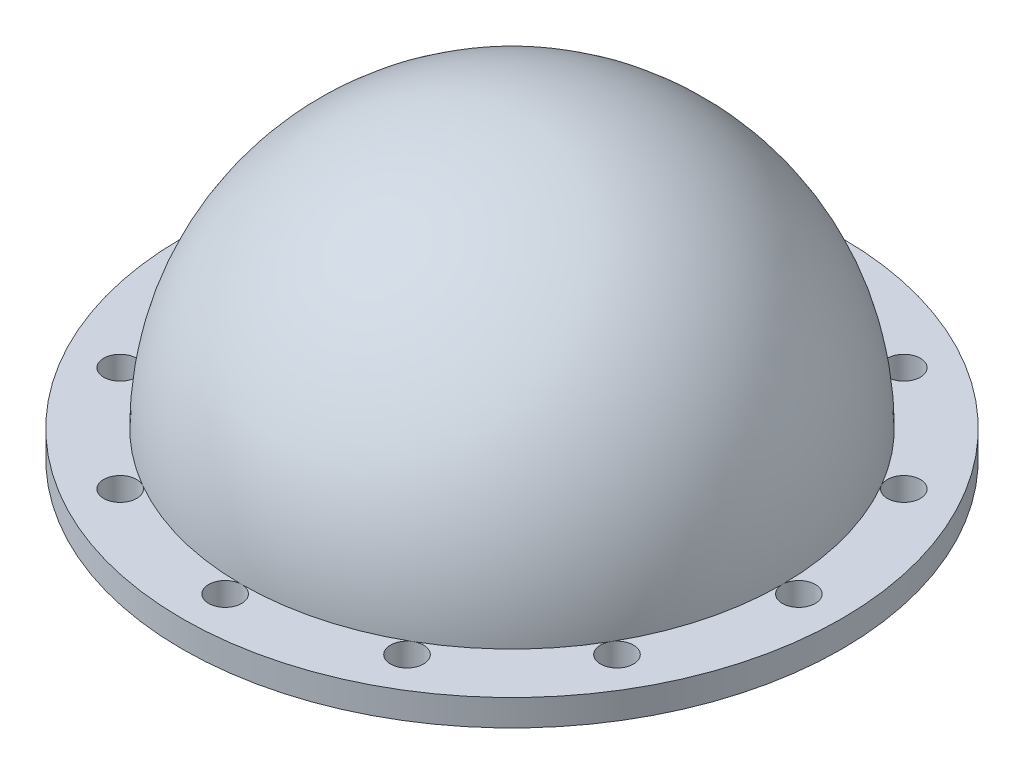
ISO-10303-21;
HEADER;
FILE_DESCRIPTION(('STEP AP214'),'2;1');
FILE_NAME('part.step','',(''),(''),'','','');
FILE_SCHEMA(('AUTOMOTIVE_DESIGN { 1 0 10303 214 1 1 1 1 }'));
ENDSEC;
DATA;
#1=APPLICATION_CONTEXT('core data for automotive mechanical design processes');
#2=APPLICATION_PROTOCOL_DEFINITION('international standard','automotive_design',2000,#1);
#3=PRODUCT_CONTEXT('',#1,'mechanical');
#4=PRODUCT('Part','Part','',(#3));
#5=PRODUCT_RELATED_PRODUCT_CATEGORY('part','',(#4));
#6=PRODUCT_DEFINITION_FORMATION('','',#4);
#7=PRODUCT_DEFINITION_CONTEXT('part definition',#1,'design');
#8=PRODUCT_DEFINITION('design','',#6,#7);
#9=PRODUCT_DEFINITION_SHAPE('','',#8);
#10=(LENGTH_UNIT() NAMED_UNIT(*) SI_UNIT(.MILLI.,.METRE.));
#11=(NAMED_UNIT(*) PLANE_ANGLE_UNIT() SI_UNIT($,.RADIAN.));
#12=(NAMED_UNIT(*) SI_UNIT($,.STERADIAN.) SOLID_ANGLE_UNIT());
#13=UNCERTAINTY_MEASURE_WITH_UNIT(LENGTH_MEASURE(1.E-05),#10,'distance_accuracy_value','');
#14=(GEOMETRIC_REPRESENTATION_CONTEXT(3) GLOBAL_UNCERTAINTY_ASSIGNED_CONTEXT((#13)) GLOBAL_UNIT_ASSIGNED_CONTEXT((#10,
#11,#12)) REPRESENTATION_CONTEXT('',''));
#15=CARTESIAN_POINT('',(0.,0.,0.));
#16=DIRECTION('',(0.,0.,1.));
#17=DIRECTION('',(1.,0.,0.));
#18=AXIS2_PLACEMENT_3D('',#15,#16,#17);
#19=CARTESIAN_POINT('',(0.,20.,0.));
#20=DIRECTION('',(0.,1.,0.));
#21=DIRECTION('',(0.,0.,1.));
#22=AXIS2_PLACEMENT_3D('',#19,#20,#21);
#23=PLANE('',#22);
#24=CARTESIAN_POINT('',(0.,20.,0.));
#25=DIRECTION('',(0.,1.,0.));
#26=DIRECTION('',(0.,0.,1.));
#27=AXIS2_PLACEMENT_3D('',#24,#25,#26);
#28=CIRCLE('',#27,250.);
#29=CARTESIAN_POINT('',(0.,20.,250.));
#30=VERTEX_POINT('',#29);
#31=EDGE_CURVE('E11',#30,#30,#28,.T.);
#32=ORIENTED_EDGE('',*,*,#31,.T.);
#33=EDGE_LOOP('',(#32));
#34=FACE_BOUND('',#33,.T.);
#35=CARTESIAN_POINT('',(-1.5543148011993E-13,20.,217.499999999931));
#36=DIRECTION('',(0.,1.,0.));
#37=DIRECTION('',(0.,0.,1.));
#38=AXIS2_PLACEMENT_3D('',#35,#36,#37);
#39=CIRCLE('',#38,12.5000000000216);
#40=CARTESIAN_POINT('',(-2.0207975645056E-12,20.,204.999999999909));
#41=VERTEX_POINT('',#40);
#42=EDGE_CURVE('E138',#41,#41,#39,.T.);
#43=ORIENTED_EDGE('',*,*,#42,.F.);
#44=CARTESIAN_POINT('',(-3.2612801348364E-11,20.,0.));
#45=DIRECTION('',(0.,-1.,0.));
#46=DIRECTION('',(-1.,0.,0.));
#47=AXIS2_PLACEMENT_3D('',#44,#45,#46);
#48=CIRCLE('',#47,204.999999999954);
#49=CARTESIAN_POINT('',(-102.499999999982,19.9999999999994,177.535207775743));
#50=VERTEX_POINT('',#49);
#51=EDGE_CURVE('E55',#41,#50,#48,.T.);
#52=ORIENTED_EDGE('',*,*,#51,.T.);
#53=CARTESIAN_POINT('',(-108.749999999983,20.,188.360525323051));
#54=DIRECTION('',(0.,1.,0.));
#55=DIRECTION('',(0.,0.,1.));
#56=AXIS2_PLACEMENT_3D('',#53,#54,#55);
#57=CIRCLE('',#56,12.5000000000039);
#58=EDGE_CURVE('E130',#50,#50,#57,.T.);
#59=ORIENTED_EDGE('',*,*,#58,.F.);
#60=CARTESIAN_POINT('',(-177.535207775791,19.9999999999996,102.499999999955));
#61=VERTEX_POINT('',#60);
#62=EDGE_CURVE('E108',#50,#61,#48,.T.);
#63=ORIENTED_EDGE('',*,*,#62,.T.);
#64=CARTESIAN_POINT('',(-188.360525323085,20.,108.749999999948));
#65=DIRECTION('',(0.,1.,0.));
#66=DIRECTION('',(0.,0.,1.));
#67=AXIS2_PLACEMENT_3D('',#64,#65,#66);
#68=CIRCLE('',#67,12.4999999999883);
#69=EDGE_CURVE('E106',#61,#61,#68,.T.);
#70=ORIENTED_EDGE('',*,*,#69,.F.);
#71=CARTESIAN_POINT('',(-204.999999999986,20.,-3.28032702722055E-11));
#72=VERTEX_POINT('',#71);
#73=EDGE_CURVE('E61',#61,#72,#48,.T.);
#74=ORIENTED_EDGE('',*,*,#73,.T.);
#75=CARTESIAN_POINT('',(-217.499999999965,20.,-3.47977577846722E-11));
#76=DIRECTION('',(0.,1.,0.));
#77=DIRECTION('',(0.,0.,1.));
#78=AXIS2_PLACEMENT_3D('',#75,#76,#77);
#79=CIRCLE('',#78,12.499999999979);
#80=EDGE_CURVE('E104',#72,#72,#79,.T.);
#81=ORIENTED_EDGE('',*,*,#80,.F.);
#82=CARTESIAN_POINT('',(-177.535207775799,20.0000000000004,-102.500000000025));
#83=VERTEX_POINT('',#82);
#84=EDGE_CURVE('E90',#72,#83,#48,.T.);
#85=ORIENTED_EDGE('',*,*,#84,.T.);
#86=CARTESIAN_POINT('',(-188.360525323085,20.,-108.750000000017));
#87=DIRECTION('',(0.,1.,0.));
#88=DIRECTION('',(0.,0.,1.));
#89=AXIS2_PLACEMENT_3D('',#86,#87,#88);
#90=CIRCLE('',#89,12.4999999999788);
#91=EDGE_CURVE('E121',#83,#83,#90,.T.);
#92=ORIENTED_EDGE('',*,*,#91,.F.);
#93=CARTESIAN_POINT('',(-102.49999999999,20.0000000000006,-177.535207775822));
#94=VERTEX_POINT('',#93);
#95=EDGE_CURVE('E93',#83,#94,#48,.T.);
#96=ORIENTED_EDGE('',*,*,#95,.T.);
#97=CARTESIAN_POINT('',(-108.749999999983,20.,-188.36052532312));
#98=DIRECTION('',(0.,1.,0.));
#99=DIRECTION('',(0.,0.,1.));
#100=AXIS2_PLACEMENT_3D('',#97,#98,#99);
#101=CIRCLE('',#100,12.4999999999875);
#102=EDGE_CURVE('E234',#94,#94,#101,.T.);
#103=ORIENTED_EDGE('',*,*,#102,.F.);
#104=CARTESIAN_POINT('',(-1.8742989280673E-12,20.0000000000007,-204.999999999997));
#105=VERTEX_POINT('',#104);
#106=EDGE_CURVE('E250',#94,#105,#48,.T.);
#107=ORIENTED_EDGE('',*,*,#106,.T.);
#108=CARTESIAN_POINT('',(0.,20.,-217.5));
#109=DIRECTION('',(0.,1.,0.));
#110=DIRECTION('',(0.,0.,1.));
#111=AXIS2_PLACEMENT_3D('',#108,#109,#110);
#112=CIRCLE('',#111,12.5);
#113=EDGE_CURVE('E186',#105,#105,#112,.T.);
#114=ORIENTED_EDGE('',*,*,#113,.F.);
#115=CARTESIAN_POINT('',(102.499999999972,20.0000000000006,-177.535207775797));
#116=VERTEX_POINT('',#115);
#117=EDGE_CURVE('E442',#105,#116,#48,.T.);
#118=ORIENTED_EDGE('',*,*,#117,.T.);
#119=CARTESIAN_POINT('',(108.749999999983,20.,-188.36052532312));
#120=DIRECTION('',(0.,1.,0.));
#121=DIRECTION('',(0.,0.,1.));
#122=AXIS2_PLACEMENT_3D('',#119,#120,#121);
#123=CIRCLE('',#122,12.5000000000182);
#124=EDGE_CURVE('E178',#116,#116,#123,.T.);
#125=ORIENTED_EDGE('',*,*,#124,.F.);
#126=CARTESIAN_POINT('',(177.535207775749,20.0000000000004,-102.499999999999));
#127=VERTEX_POINT('',#126);
#128=EDGE_CURVE('E438',#116,#127,#48,.T.);
#129=ORIENTED_EDGE('',*,*,#128,.T.);
#130=CARTESIAN_POINT('',(188.360525323085,20.,-108.750000000017));
#131=DIRECTION('',(0.,1.,0.));
#132=DIRECTION('',(0.,0.,1.));
#133=AXIS2_PLACEMENT_3D('',#130,#131,#132);
#134=CIRCLE('',#133,12.5000000000343);
#135=EDGE_CURVE('E170',#127,#127,#134,.T.);
#136=ORIENTED_EDGE('',*,*,#135,.F.);
#137=CARTESIAN_POINT('',(204.999999999921,20.,-3.26818768951433E-11));
#138=VERTEX_POINT('',#137);
#139=EDGE_CURVE('E434',#127,#138,#48,.T.);
#140=ORIENTED_EDGE('',*,*,#139,.T.);
#141=CARTESIAN_POINT('',(217.499999999965,20.,-3.46689623724338E-11));
#142=DIRECTION('',(0.,1.,0.));
#143=DIRECTION('',(0.,0.,1.));
#144=AXIS2_PLACEMENT_3D('',#141,#142,#143);
#145=CIRCLE('',#144,12.5000000000441);
#146=EDGE_CURVE('E162',#138,#138,#145,.T.);
#147=ORIENTED_EDGE('',*,*,#146,.F.);
#148=CARTESIAN_POINT('',(177.535207775741,19.9999999999996,102.499999999928));
#149=VERTEX_POINT('',#148);
#150=EDGE_CURVE('E430',#138,#149,#48,.T.);
#151=ORIENTED_EDGE('',*,*,#150,.T.);
#152=CARTESIAN_POINT('',(188.360525323085,20.,108.749999999948));
#153=DIRECTION('',(0.,1.,0.));
#154=DIRECTION('',(0.,0.,1.));
#155=AXIS2_PLACEMENT_3D('',#152,#153,#154);
#156=CIRCLE('',#155,12.5000000000449);
#157=EDGE_CURVE('E154',#149,#149,#156,.T.);
#158=ORIENTED_EDGE('',*,*,#157,.F.);
#159=CARTESIAN_POINT('',(102.499999999963,19.9999999999994,177.535207775717));
#160=VERTEX_POINT('',#159);
#161=EDGE_CURVE('E426',#149,#160,#48,.T.);
#162=ORIENTED_EDGE('',*,*,#161,.T.);
#163=CARTESIAN_POINT('',(108.749999999983,20.,188.360525323051));
#164=DIRECTION('',(0.,1.,0.));
#165=DIRECTION('',(0.,0.,1.));
#166=AXIS2_PLACEMENT_3D('',#163,#164,#165);
#167=CIRCLE('',#166,12.5000000000367);
#168=EDGE_CURVE('E146',#160,#160,#167,.T.);
#169=ORIENTED_EDGE('',*,*,#168,.F.);
#170=EDGE_CURVE('E423',#160,#41,#48,.T.);
#171=ORIENTED_EDGE('',*,*,#170,.T.);
#172=EDGE_LOOP('',(#43,#52,#59,#63,#70,#74,#81,#85,#92,#96,#103,#107,#114,#118,#125,#129,#136,
#140,#147,#151,#158,#162,#169,#171));
#173=FACE_BOUND('',#172,.T.);
#174=ADVANCED_FACE('F39',(#34,#173),#23,.T.);
#175=CARTESIAN_POINT('',(0.,0.,0.));
#176=DIRECTION('',(0.,1.,0.));
#177=DIRECTION('',(0.,0.,1.));
#178=AXIS2_PLACEMENT_3D('',#175,#176,#177);
#179=PLANE('',#178);
#180=CARTESIAN_POINT('',(0.,0.,0.));
#181=DIRECTION('',(0.,1.,0.));
#182=DIRECTION('',(0.,0.,1.));
#183=AXIS2_PLACEMENT_3D('',#180,#181,#182);
#184=CIRCLE('',#183,250.);
#185=CARTESIAN_POINT('',(0.,0.,250.));
#186=VERTEX_POINT('',#185);
#187=EDGE_CURVE('E43',#186,#186,#184,.T.);
#188=ORIENTED_EDGE('',*,*,#187,.F.);
#189=EDGE_LOOP('',(#188));
#190=FACE_BOUND('',#189,.T.);
#191=CARTESIAN_POINT('',(0.,0.,0.));
#192=DIRECTION('',(0.,1.,0.));
#193=DIRECTION('',(0.,0.,1.));
#194=AXIS2_PLACEMENT_3D('',#191,#192,#193);
#195=CIRCLE('',#194,180.);
#196=CARTESIAN_POINT('',(0.,0.,180.));
#197=VERTEX_POINT('',#196);
#198=EDGE_CURVE('E190',#197,#197,#195,.T.);
#199=ORIENTED_EDGE('',*,*,#198,.T.);
#200=EDGE_LOOP('',(#199));
#201=FACE_BOUND('',#200,.T.);
#202=CARTESIAN_POINT('',(0.,0.,-217.5));
#203=DIRECTION('',(0.,1.,0.));
#204=DIRECTION('',(0.,0.,1.));
#205=AXIS2_PLACEMENT_3D('',#202,#203,#204);
#206=CIRCLE('',#205,12.5);
#207=CARTESIAN_POINT('',(0.,0.,-205.));
#208=VERTEX_POINT('',#207);
#209=EDGE_CURVE('E182',#208,#208,#206,.T.);
#210=ORIENTED_EDGE('',*,*,#209,.T.);
#211=EDGE_LOOP('',(#210));
#212=FACE_BOUND('',#211,.T.);
#213=CARTESIAN_POINT('',(108.749999999983,0.,-188.36052532312));
#214=DIRECTION('',(0.,1.,0.));
#215=DIRECTION('',(0.,0.,1.));
#216=AXIS2_PLACEMENT_3D('',#213,#214,#215);
#217=CIRCLE('',#216,12.5000000000182);
#218=CARTESIAN_POINT('',(108.749999999983,0.,-175.860525323102));
#219=VERTEX_POINT('',#218);
#220=EDGE_CURVE('E174',#219,#219,#217,.T.);
#221=ORIENTED_EDGE('',*,*,#220,.T.);
#222=EDGE_LOOP('',(#221));
#223=FACE_BOUND('',#222,.T.);
#224=CARTESIAN_POINT('',(188.360525323085,0.,-108.750000000017));
#225=DIRECTION('',(0.,1.,0.));
#226=DIRECTION('',(0.,0.,1.));
#227=AXIS2_PLACEMENT_3D('',#224,#225,#226);
#228=CIRCLE('',#227,12.5000000000343);
#229=CARTESIAN_POINT('',(188.360525323085,0.,-96.249999999983));
#230=VERTEX_POINT('',#229);
#231=EDGE_CURVE('E166',#230,#230,#228,.T.);
#232=ORIENTED_EDGE('',*,*,#231,.T.);
#233=EDGE_LOOP('',(#232));
#234=FACE_BOUND('',#233,.T.);
#235=CARTESIAN_POINT('',(217.499999999965,0.,-3.46689623724338E-11));
#236=DIRECTION('',(0.,1.,0.));
#237=DIRECTION('',(0.,0.,1.));
#238=AXIS2_PLACEMENT_3D('',#235,#236,#237);
#239=CIRCLE('',#238,12.5000000000441);
#240=CARTESIAN_POINT('',(217.499999999965,0.,12.5000000000094));
#241=VERTEX_POINT('',#240);
#242=EDGE_CURVE('E158',#241,#241,#239,.T.);
#243=ORIENTED_EDGE('',*,*,#242,.T.);
#244=EDGE_LOOP('',(#243));
#245=FACE_BOUND('',#244,.T.);
#246=CARTESIAN_POINT('',(188.360525323085,0.,108.749999999948));
#247=DIRECTION('',(0.,1.,0.));
#248=DIRECTION('',(0.,0.,1.));
#249=AXIS2_PLACEMENT_3D('',#246,#247,#248);
#250=CIRCLE('',#249,12.5000000000449);
#251=CARTESIAN_POINT('',(188.360525323085,0.,121.249999999993));
#252=VERTEX_POINT('',#251);
#253=EDGE_CURVE('E150',#252,#252,#250,.T.);
#254=ORIENTED_EDGE('',*,*,#253,.T.);
#255=EDGE_LOOP('',(#254));
#256=FACE_BOUND('',#255,.T.);
#257=CARTESIAN_POINT('',(108.749999999983,0.,188.360525323051));
#258=DIRECTION('',(0.,1.,0.));
#259=DIRECTION('',(0.,0.,1.));
#260=AXIS2_PLACEMENT_3D('',#257,#258,#259);
#261=CIRCLE('',#260,12.5000000000367);
#262=CARTESIAN_POINT('',(108.749999999983,0.,200.860525323087));
#263=VERTEX_POINT('',#262);
#264=EDGE_CURVE('E142',#263,#263,#261,.T.);
#265=ORIENTED_EDGE('',*,*,#264,.T.);
#266=EDGE_LOOP('',(#265));
#267=FACE_BOUND('',#266,.T.);
#268=CARTESIAN_POINT('',(-1.5543148011993E-13,0.,217.499999999931));
#269=DIRECTION('',(0.,1.,0.));
#270=DIRECTION('',(0.,0.,1.));
#271=AXIS2_PLACEMENT_3D('',#268,#269,#270);
#272=CIRCLE('',#271,12.5000000000216);
#273=CARTESIAN_POINT('',(-1.5543148011993E-13,0.,229.999999999952));
#274=VERTEX_POINT('',#273);
#275=EDGE_CURVE('E134',#274,#274,#272,.T.);
#276=ORIENTED_EDGE('',*,*,#275,.T.);
#277=EDGE_LOOP('',(#276));
#278=FACE_BOUND('',#277,.T.);
#279=CARTESIAN_POINT('',(-108.749999999983,0.,188.360525323051));
#280=DIRECTION('',(0.,1.,0.));
#281=DIRECTION('',(0.,0.,1.));
#282=AXIS2_PLACEMENT_3D('',#279,#280,#281);
#283=CIRCLE('',#282,12.5000000000039);
#284=CARTESIAN_POINT('',(-108.749999999983,0.,200.860525323055));
#285=VERTEX_POINT('',#284);
#286=EDGE_CURVE('E128',#285,#285,#283,.T.);
#287=ORIENTED_EDGE('',*,*,#286,.T.);
#288=EDGE_LOOP('',(#287));
#289=FACE_BOUND('',#288,.T.);
#290=CARTESIAN_POINT('',(-188.360525323085,0.,108.749999999948));
#291=DIRECTION('',(0.,1.,0.));
#292=DIRECTION('',(0.,0.,1.));
#293=AXIS2_PLACEMENT_3D('',#290,#291,#292);
#294=CIRCLE('',#293,12.4999999999883);
#295=CARTESIAN_POINT('',(-188.360525323085,0.,121.249999999936));
#296=VERTEX_POINT('',#295);
#297=EDGE_CURVE('E113',#296,#296,#294,.T.);
#298=ORIENTED_EDGE('',*,*,#297,.T.);
#299=EDGE_LOOP('',(#298));
#300=FACE_BOUND('',#299,.T.);
#301=CARTESIAN_POINT('',(-217.499999999965,0.,-3.47977577846722E-11));
#302=DIRECTION('',(0.,1.,0.));
#303=DIRECTION('',(0.,0.,1.));
#304=AXIS2_PLACEMENT_3D('',#301,#302,#303);
#305=CIRCLE('',#304,12.499999999979);
#306=CARTESIAN_POINT('',(-217.499999999965,0.,12.4999999999442));
#307=VERTEX_POINT('',#306);
#308=EDGE_CURVE('E114',#307,#307,#305,.T.);
#309=ORIENTED_EDGE('',*,*,#308,.T.);
#310=EDGE_LOOP('',(#309));
#311=FACE_BOUND('',#310,.T.);
#312=CARTESIAN_POINT('',(-188.360525323085,0.,-108.750000000017));
#313=DIRECTION('',(0.,1.,0.));
#314=DIRECTION('',(0.,0.,1.));
#315=AXIS2_PLACEMENT_3D('',#312,#313,#314);
#316=CIRCLE('',#315,12.4999999999788);
#317=CARTESIAN_POINT('',(-188.360525323085,0.,-96.2500000000385));
#318=VERTEX_POINT('',#317);
#319=EDGE_CURVE('E124',#318,#318,#316,.T.);
#320=ORIENTED_EDGE('',*,*,#319,.T.);
#321=EDGE_LOOP('',(#320));
#322=FACE_BOUND('',#321,.T.);
#323=CARTESIAN_POINT('',(-108.749999999983,0.,-188.36052532312));
#324=DIRECTION('',(0.,1.,0.));
#325=DIRECTION('',(0.,0.,1.));
#326=AXIS2_PLACEMENT_3D('',#323,#324,#325);
#327=CIRCLE('',#326,12.4999999999875);
#328=CARTESIAN_POINT('',(-108.749999999983,0.,-175.860525323133));
#329=VERTEX_POINT('',#328);
#330=EDGE_CURVE('E231',#329,#329,#327,.T.);
#331=ORIENTED_EDGE('',*,*,#330,.T.);
#332=EDGE_LOOP('',(#331));
#333=FACE_BOUND('',#332,.T.);
#334=ADVANCED_FACE('F203',(#190,#201,#212,#223,#234,#245,#256,#267,#278,#289,#300,#311,#322,
#333),#179,.F.);
#335=CARTESIAN_POINT('',(0.,20.,0.));
#336=DIRECTION('',(0.,-1.,0.));
#337=DIRECTION('',(0.,0.,-1.));
#338=AXIS2_PLACEMENT_3D('',#335,#336,#337);
#339=CYLINDRICAL_SURFACE('',#338,250.);
#340=ORIENTED_EDGE('',*,*,#31,.F.);
#341=EDGE_LOOP('',(#340));
#342=FACE_BOUND('',#341,.T.);
#343=ORIENTED_EDGE('',*,*,#187,.T.);
#344=EDGE_LOOP('',(#343));
#345=FACE_BOUND('',#344,.T.);
#346=ADVANCED_FACE('F41',(#342,#345),#339,.T.);
#347=CARTESIAN_POINT('',(0.,20.,0.));
#348=DIRECTION('',(0.,-1.,0.));
#349=DIRECTION('',(0.,0.,-1.));
#350=AXIS2_PLACEMENT_3D('',#347,#348,#349);
#351=CYLINDRICAL_SURFACE('',#350,180.);
#352=CARTESIAN_POINT('',(0.,20.,0.));
#353=DIRECTION('',(0.,1.,0.));
#354=DIRECTION('',(-1.,0.,0.));
#355=AXIS2_PLACEMENT_3D('',#352,#353,#354);
#356=CIRCLE('',#355,180.);
#357=CARTESIAN_POINT('',(-180.,20.,0.));
#358=VERTEX_POINT('',#357);
#359=EDGE_CURVE('E99',#358,#358,#356,.T.);
#360=ORIENTED_EDGE('',*,*,#359,.T.);
#361=EDGE_LOOP('',(#360));
#362=FACE_BOUND('',#361,.T.);
#363=ORIENTED_EDGE('',*,*,#198,.F.);
#364=EDGE_LOOP('',(#363));
#365=FACE_BOUND('',#364,.T.);
#366=ADVANCED_FACE('F269',(#362,#365),#351,.F.);
#367=CARTESIAN_POINT('',(0.,20.,-217.5));
#368=DIRECTION('',(0.,-1.,0.));
#369=DIRECTION('',(0.,0.,-1.));
#370=AXIS2_PLACEMENT_3D('',#367,#368,#369);
#371=CYLINDRICAL_SURFACE('',#370,12.5);
#372=ORIENTED_EDGE('',*,*,#113,.T.);
#373=EDGE_LOOP('',(#372));
#374=FACE_BOUND('',#373,.T.);
#375=ORIENTED_EDGE('',*,*,#209,.F.);
#376=EDGE_LOOP('',(#375));
#377=FACE_BOUND('',#376,.T.);
#378=ADVANCED_FACE('F272',(#374,#377),#371,.F.);
#379=CARTESIAN_POINT('',(108.749999999983,20.,-188.36052532312));
#380=DIRECTION('',(0.,-1.,0.));
#381=DIRECTION('',(0.,0.,-1.));
#382=AXIS2_PLACEMENT_3D('',#379,#380,#381);
#383=CYLINDRICAL_SURFACE('',#382,12.5000000000182);
#384=ORIENTED_EDGE('',*,*,#124,.T.);
#385=EDGE_LOOP('',(#384));
#386=FACE_BOUND('',#385,.T.);
#387=ORIENTED_EDGE('',*,*,#220,.F.);
#388=EDGE_LOOP('',(#387));
#389=FACE_BOUND('',#388,.T.);
#390=ADVANCED_FACE('F276',(#386,#389),#383,.F.);
#391=CARTESIAN_POINT('',(188.360525323085,20.,-108.750000000017));
#392=DIRECTION('',(0.,-1.,0.));
#393=DIRECTION('',(0.,0.,-1.));
#394=AXIS2_PLACEMENT_3D('',#391,#392,#393);
#395=CYLINDRICAL_SURFACE('',#394,12.5000000000343);
#396=ORIENTED_EDGE('',*,*,#135,.T.);
#397=EDGE_LOOP('',(#396));
#398=FACE_BOUND('',#397,.T.);
#399=ORIENTED_EDGE('',*,*,#231,.F.);
#400=EDGE_LOOP('',(#399));
#401=FACE_BOUND('',#400,.T.);
#402=ADVANCED_FACE('F280',(#398,#401),#395,.F.);
#403=CARTESIAN_POINT('',(217.499999999965,20.,-3.46689623724338E-11));
#404=DIRECTION('',(0.,-1.,0.));
#405=DIRECTION('',(0.,0.,-1.));
#406=AXIS2_PLACEMENT_3D('',#403,#404,#405);
#407=CYLINDRICAL_SURFACE('',#406,12.5000000000441);
#408=ORIENTED_EDGE('',*,*,#146,.T.);
#409=EDGE_LOOP('',(#408));
#410=FACE_BOUND('',#409,.T.);
#411=ORIENTED_EDGE('',*,*,#242,.F.);
#412=EDGE_LOOP('',(#411));
#413=FACE_BOUND('',#412,.T.);
#414=ADVANCED_FACE('F284',(#410,#413),#407,.F.);
#415=CARTESIAN_POINT('',(188.360525323085,20.,108.749999999948));
#416=DIRECTION('',(0.,-1.,0.));
#417=DIRECTION('',(0.,0.,-1.));
#418=AXIS2_PLACEMENT_3D('',#415,#416,#417);
#419=CYLINDRICAL_SURFACE('',#418,12.5000000000449);
#420=ORIENTED_EDGE('',*,*,#157,.T.);
#421=EDGE_LOOP('',(#420));
#422=FACE_BOUND('',#421,.T.);
#423=ORIENTED_EDGE('',*,*,#253,.F.);
#424=EDGE_LOOP('',(#423));
#425=FACE_BOUND('',#424,.T.);
#426=ADVANCED_FACE('F288',(#422,#425),#419,.F.);
#427=CARTESIAN_POINT('',(108.749999999983,20.,188.360525323051));
#428=DIRECTION('',(0.,-1.,0.));
#429=DIRECTION('',(0.,0.,-1.));
#430=AXIS2_PLACEMENT_3D('',#427,#428,#429);
#431=CYLINDRICAL_SURFACE('',#430,12.5000000000367);
#432=ORIENTED_EDGE('',*,*,#168,.T.);
#433=EDGE_LOOP('',(#432));
#434=FACE_BOUND('',#433,.T.);
#435=ORIENTED_EDGE('',*,*,#264,.F.);
#436=EDGE_LOOP('',(#435));
#437=FACE_BOUND('',#436,.T.);
#438=ADVANCED_FACE('F292',(#434,#437),#431,.F.);
#439=CARTESIAN_POINT('',(-1.5543148011993E-13,20.,217.499999999931));
#440=DIRECTION('',(0.,-1.,0.));
#441=DIRECTION('',(0.,0.,-1.));
#442=AXIS2_PLACEMENT_3D('',#439,#440,#441);
#443=CYLINDRICAL_SURFACE('',#442,12.5000000000216);
#444=ORIENTED_EDGE('',*,*,#42,.T.);
#445=EDGE_LOOP('',(#444));
#446=FACE_BOUND('',#445,.T.);
#447=ORIENTED_EDGE('',*,*,#275,.F.);
#448=EDGE_LOOP('',(#447));
#449=FACE_BOUND('',#448,.T.);
#450=ADVANCED_FACE('F296',(#446,#449),#443,.F.);
#451=CARTESIAN_POINT('',(-108.749999999983,20.,188.360525323051));
#452=DIRECTION('',(0.,-1.,0.));
#453=DIRECTION('',(0.,0.,-1.));
#454=AXIS2_PLACEMENT_3D('',#451,#452,#453);
#455=CYLINDRICAL_SURFACE('',#454,12.5000000000039);
#456=ORIENTED_EDGE('',*,*,#58,.T.);
#457=EDGE_LOOP('',(#456));
#458=FACE_BOUND('',#457,.T.);
#459=ORIENTED_EDGE('',*,*,#286,.F.);
#460=EDGE_LOOP('',(#459));
#461=FACE_BOUND('',#460,.T.);
#462=ADVANCED_FACE('F300',(#458,#461),#455,.F.);
#463=CARTESIAN_POINT('',(-188.360525323085,20.,108.749999999948));
#464=DIRECTION('',(0.,-1.,0.));
#465=DIRECTION('',(0.,0.,-1.));
#466=AXIS2_PLACEMENT_3D('',#463,#464,#465);
#467=CYLINDRICAL_SURFACE('',#466,12.4999999999883);
#468=ORIENTED_EDGE('',*,*,#69,.T.);
#469=EDGE_LOOP('',(#468));
#470=FACE_BOUND('',#469,.T.);
#471=ORIENTED_EDGE('',*,*,#297,.F.);
#472=EDGE_LOOP('',(#471));
#473=FACE_BOUND('',#472,.T.);
#474=ADVANCED_FACE('F304',(#470,#473),#467,.F.);
#475=CARTESIAN_POINT('',(-217.499999999965,20.,-3.47977577846722E-11));
#476=DIRECTION('',(0.,-1.,0.));
#477=DIRECTION('',(0.,0.,-1.));
#478=AXIS2_PLACEMENT_3D('',#475,#476,#477);
#479=CYLINDRICAL_SURFACE('',#478,12.499999999979);
#480=ORIENTED_EDGE('',*,*,#80,.T.);
#481=EDGE_LOOP('',(#480));
#482=FACE_BOUND('',#481,.T.);
#483=ORIENTED_EDGE('',*,*,#308,.F.);
#484=EDGE_LOOP('',(#483));
#485=FACE_BOUND('',#484,.T.);
#486=ADVANCED_FACE('F110',(#482,#485),#479,.F.);
#487=CARTESIAN_POINT('',(-188.360525323085,20.,-108.750000000017));
#488=DIRECTION('',(0.,-1.,0.));
#489=DIRECTION('',(0.,0.,-1.));
#490=AXIS2_PLACEMENT_3D('',#487,#488,#489);
#491=CYLINDRICAL_SURFACE('',#490,12.4999999999788);
#492=ORIENTED_EDGE('',*,*,#91,.T.);
#493=EDGE_LOOP('',(#492));
#494=FACE_BOUND('',#493,.T.);
#495=ORIENTED_EDGE('',*,*,#319,.F.);
#496=EDGE_LOOP('',(#495));
#497=FACE_BOUND('',#496,.T.);
#498=ADVANCED_FACE('F245',(#494,#497),#491,.F.);
#499=CARTESIAN_POINT('',(-108.749999999983,20.,-188.36052532312));
#500=DIRECTION('',(0.,-1.,0.));
#501=DIRECTION('',(0.,0.,-1.));
#502=AXIS2_PLACEMENT_3D('',#499,#500,#501);
#503=CYLINDRICAL_SURFACE('',#502,12.4999999999875);
#504=ORIENTED_EDGE('',*,*,#102,.T.);
#505=EDGE_LOOP('',(#504));
#506=FACE_BOUND('',#505,.T.);
#507=ORIENTED_EDGE('',*,*,#330,.F.);
#508=EDGE_LOOP('',(#507));
#509=FACE_BOUND('',#508,.T.);
#510=ADVANCED_FACE('F252',(#506,#509),#503,.F.);
#511=CARTESIAN_POINT('',(0.,20.,0.));
#512=DIRECTION('',(-1.,0.,0.));
#513=DIRECTION('',(0.,0.,-1.));
#514=AXIS2_PLACEMENT_3D('',#511,#512,#513);
#515=SPHERICAL_SURFACE('',#514,180.);
#516=CARTESIAN_POINT('',(0.,20.,0.));
#517=DIRECTION('',(0.,1.,0.));
#518=DIRECTION('',(-1.,0.,0.));
#519=AXIS2_PLACEMENT_3D('',#516,#517,#518);
#520=SPHERICAL_SURFACE('',#519,180.);
#521=ORIENTED_EDGE('',*,*,#359,.F.);
#522=EDGE_LOOP('',(#521));
#523=FACE_BOUND('',#522,.T.);
#524=ADVANCED_FACE('F254',(#523),#520,.F.);
#525=CARTESIAN_POINT('',(-3.2612801348364E-11,20.,0.));
#526=DIRECTION('',(-1.,0.,0.));
#527=DIRECTION('',(0.,0.,1.));
#528=AXIS2_PLACEMENT_3D('',#525,#526,#527);
#529=SPHERICAL_SURFACE('',#528,204.999999999954);
#530=CARTESIAN_POINT('',(-3.2612801348364E-11,20.,0.));
#531=DIRECTION('',(0.,-1.,0.));
#532=DIRECTION('',(-1.,0.,0.));
#533=AXIS2_PLACEMENT_3D('',#530,#531,#532);
#534=SPHERICAL_SURFACE('',#533,204.999999999954);
#535=ORIENTED_EDGE('',*,*,#84,.F.);
#536=ORIENTED_EDGE('',*,*,#73,.F.);
#537=ORIENTED_EDGE('',*,*,#62,.F.);
#538=ORIENTED_EDGE('',*,*,#51,.F.);
#539=ORIENTED_EDGE('',*,*,#170,.F.);
#540=ORIENTED_EDGE('',*,*,#161,.F.);
#541=ORIENTED_EDGE('',*,*,#150,.F.);
#542=ORIENTED_EDGE('',*,*,#139,.F.);
#543=ORIENTED_EDGE('',*,*,#128,.F.);
#544=ORIENTED_EDGE('',*,*,#117,.F.);
#545=ORIENTED_EDGE('',*,*,#106,.F.);
#546=ORIENTED_EDGE('',*,*,#95,.F.);
#547=EDGE_LOOP('',(#535,#536,#537,#538,#539,#540,#541,#542,#543,#544,#545,#546));
#548=FACE_BOUND('',#547,.T.);
#549=ADVANCED_FACE('F91',(#548),#534,.T.);
#550=CLOSED_SHELL('',(#174,#334,#346,#366,#378,#390,#402,#414,#426,#438,#450,#462,#474,#486,
#498,#510,#524,#549));
#551=MANIFOLD_SOLID_BREP('B2',#550);
#552=ADVANCED_BREP_SHAPE_REPRESENTATION('',(#18,#551),#14);
#553=SHAPE_DEFINITION_REPRESENTATION(#9,#552);
ENDSEC;
END-ISO-10303-21;
